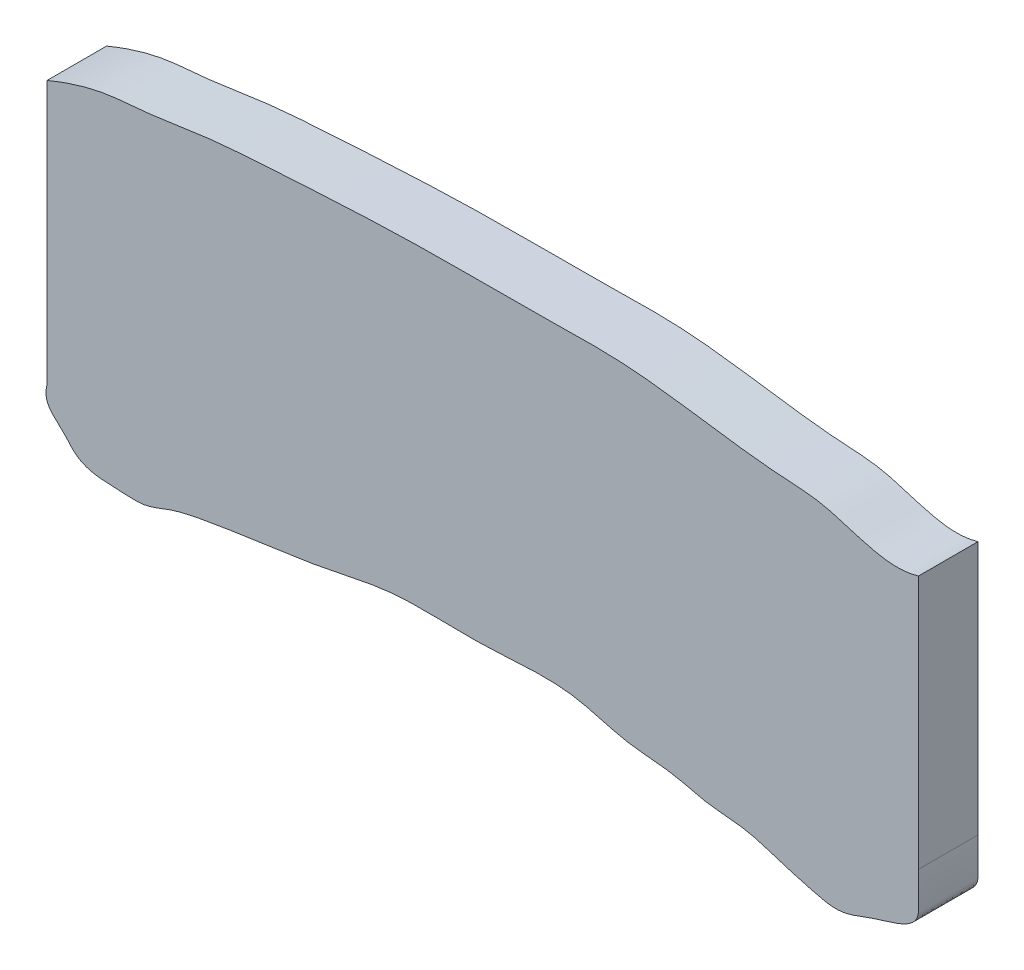
ISO-10303-21;
HEADER;
FILE_DESCRIPTION(('STEP AP214'),'2;1');
FILE_NAME('part.step','',(''),(''),'','','');
FILE_SCHEMA(('AUTOMOTIVE_DESIGN { 1 0 10303 214 1 1 1 1 }'));
ENDSEC;
DATA;
#1=APPLICATION_CONTEXT('core data for automotive mechanical design processes');
#2=APPLICATION_PROTOCOL_DEFINITION('international standard','automotive_design',2000,#1);
#3=PRODUCT_CONTEXT('',#1,'mechanical');
#4=PRODUCT('Part','Part','',(#3));
#5=PRODUCT_RELATED_PRODUCT_CATEGORY('part','',(#4));
#6=PRODUCT_DEFINITION_FORMATION('','',#4);
#7=PRODUCT_DEFINITION_CONTEXT('part definition',#1,'design');
#8=PRODUCT_DEFINITION('design','',#6,#7);
#9=PRODUCT_DEFINITION_SHAPE('','',#8);
#10=(LENGTH_UNIT() NAMED_UNIT(*) SI_UNIT(.MILLI.,.METRE.));
#11=(NAMED_UNIT(*) PLANE_ANGLE_UNIT() SI_UNIT($,.RADIAN.));
#12=(NAMED_UNIT(*) SI_UNIT($,.STERADIAN.) SOLID_ANGLE_UNIT());
#13=UNCERTAINTY_MEASURE_WITH_UNIT(LENGTH_MEASURE(1.E-05),#10,'distance_accuracy_value','');
#14=(GEOMETRIC_REPRESENTATION_CONTEXT(3) GLOBAL_UNCERTAINTY_ASSIGNED_CONTEXT((#13)) GLOBAL_UNIT_ASSIGNED_CONTEXT((#10,
#11,#12)) REPRESENTATION_CONTEXT('',''));
#15=CARTESIAN_POINT('',(0.,0.,0.));
#16=DIRECTION('',(0.,0.,1.));
#17=DIRECTION('',(1.,0.,0.));
#18=AXIS2_PLACEMENT_3D('',#15,#16,#17);
#19=CARTESIAN_POINT('',(-13.2571013773825,28.2585387527898,3.8));
#20=CARTESIAN_POINT('',(-15.4974356512467,27.6047260400092,3.8));
#21=CARTESIAN_POINT('',(-18.1835189397139,29.253879384158,3.8));
#22=CARTESIAN_POINT('',(-24.7072844304815,29.4672567119172,3.8));
#23=CARTESIAN_POINT('',(-30.3740244250129,30.768039626684,3.8));
#24=CARTESIAN_POINT('',(-38.3489185422582,30.5368464191479,3.8));
#25=CARTESIAN_POINT('',(-44.7116833381105,30.6412577327282,3.8));
#26=CARTESIAN_POINT('',(-51.0260034583777,30.3316254636872,3.8));
#27=CARTESIAN_POINT('',(-55.4847653405452,30.067836130243,3.8));
#28=CARTESIAN_POINT('',(-59.0076715337762,29.7964066333727,3.8));
#29=CARTESIAN_POINT('',(-62.2296668189302,29.2069217500653,3.8));
#30=CARTESIAN_POINT('',(-65.5795644303926,29.069387662969,3.8));
#31=CARTESIAN_POINT('',(-67.7811100596924,28.2991119938992,3.8));
#32=CARTESIAN_POINT('',(-68.8776447884064,27.8462543284039,3.8));
#33=B_SPLINE_CURVE_WITH_KNOTS('',3,(#19,#20,#21,#22,#23,#24,#25,#26,#27,#28,#29,#30,#31,#32),
.UNSPECIFIED.,.F.,.F.,(4,1,1,1,1,1,1,1,1,1,1,4),(0.,0.114786769284681,0.156767313353473,
0.347335793623414,0.423148652275247,0.582582532626668,0.688002569693344,0.761196082766196,
0.821657938446115,0.876842424501546,0.93630929657201,1.),.UNSPECIFIED.);
#34=DIRECTION('',(0.,0.,-1.));
#35=VECTOR('',#34,1.);
#36=SURFACE_OF_LINEAR_EXTRUSION('',#33,#35);
#37=CARTESIAN_POINT('',(-13.2571013773825,28.2585387527898,0.));
#38=CARTESIAN_POINT('',(-15.4974356512467,27.6047260400092,0.));
#39=CARTESIAN_POINT('',(-18.1835189397139,29.253879384158,0.));
#40=CARTESIAN_POINT('',(-24.7072844304815,29.4672567119172,0.));
#41=CARTESIAN_POINT('',(-30.3740244250129,30.768039626684,0.));
#42=CARTESIAN_POINT('',(-38.3489185422582,30.5368464191479,0.));
#43=CARTESIAN_POINT('',(-44.7116833381105,30.6412577327282,0.));
#44=CARTESIAN_POINT('',(-51.0260034583777,30.3316254636872,0.));
#45=CARTESIAN_POINT('',(-55.4847653405452,30.067836130243,0.));
#46=CARTESIAN_POINT('',(-59.0076715337762,29.7964066333727,0.));
#47=CARTESIAN_POINT('',(-62.2296668189302,29.2069217500653,0.));
#48=CARTESIAN_POINT('',(-65.5795644303926,29.069387662969,0.));
#49=CARTESIAN_POINT('',(-67.7811100596924,28.2991119938992,0.));
#50=CARTESIAN_POINT('',(-68.8776447884064,27.8462543284039,0.));
#51=B_SPLINE_CURVE_WITH_KNOTS('',3,(#37,#38,#39,#40,#41,#42,#43,#44,#45,#46,#47,#48,#49,#50),
.UNSPECIFIED.,.F.,.F.,(4,1,1,1,1,1,1,1,1,1,1,4),(0.,0.114786769284681,0.156767313353473,
0.347335793623414,0.423148652275247,0.582582532626668,0.688002569693344,0.761196082766196,
0.821657938446115,0.876842424501546,0.93630929657201,1.),.UNSPECIFIED.);
#52=CARTESIAN_POINT('',(-13.2571013773825,28.2585387527898,0.));
#53=VERTEX_POINT('',#52);
#54=CARTESIAN_POINT('',(-68.8776447884064,27.8462543284039,0.));
#55=VERTEX_POINT('',#54);
#56=EDGE_CURVE('E113',#53,#55,#51,.T.);
#57=ORIENTED_EDGE('',*,*,#56,.T.);
#58=DIRECTION('',(0.,0.,-1.));
#59=VECTOR('',#58,1.);
#60=CARTESIAN_POINT('',(-68.8776447884064,27.8462543284039,3.8));
#61=LINE('',#60,#59);
#62=CARTESIAN_POINT('',(-68.8776447884064,27.8462543284039,3.8));
#63=VERTEX_POINT('',#62);
#64=EDGE_CURVE('E11',#63,#55,#61,.T.);
#65=ORIENTED_EDGE('',*,*,#64,.F.);
#66=CARTESIAN_POINT('',(-13.2571013773825,28.2585387527898,3.8));
#67=VERTEX_POINT('',#66);
#68=EDGE_CURVE('E82',#67,#63,#33,.T.);
#69=ORIENTED_EDGE('',*,*,#68,.F.);
#70=DIRECTION('',(0.,0.,-1.));
#71=VECTOR('',#70,1.);
#72=CARTESIAN_POINT('',(-13.2571013773825,28.2585387527898,3.8));
#73=LINE('',#72,#71);
#74=EDGE_CURVE('E90',#67,#53,#73,.T.);
#75=ORIENTED_EDGE('',*,*,#74,.T.);
#76=EDGE_LOOP('',(#57,#65,#69,#75));
#77=FACE_BOUND('',#76,.T.);
#78=ADVANCED_FACE('F30',(#77),#36,.F.);
#79=CARTESIAN_POINT('',(-68.8776447884064,11.0225629397963,3.8));
#80=DIRECTION('',(1.,0.,0.));
#81=DIRECTION('',(0.,0.,-1.));
#82=AXIS2_PLACEMENT_3D('',#79,#80,#81);
#83=PLANE('',#82);
#84=DIRECTION('',(0.,-1.,0.));
#85=VECTOR('',#84,1.);
#86=CARTESIAN_POINT('',(-68.8776447884064,11.0225629397963,0.));
#87=LINE('',#86,#85);
#88=CARTESIAN_POINT('',(-68.8776447884064,11.0225629397963,0.));
#89=VERTEX_POINT('',#88);
#90=EDGE_CURVE('E86',#55,#89,#87,.T.);
#91=ORIENTED_EDGE('',*,*,#90,.T.);
#92=DIRECTION('',(0.,0.,-1.));
#93=VECTOR('',#92,1.);
#94=CARTESIAN_POINT('',(-68.8776447884064,11.0225629397963,3.8));
#95=LINE('',#94,#93);
#96=CARTESIAN_POINT('',(-68.8776447884064,11.0225629397963,3.8));
#97=VERTEX_POINT('',#96);
#98=EDGE_CURVE('E39',#97,#89,#95,.T.);
#99=ORIENTED_EDGE('',*,*,#98,.F.);
#100=DIRECTION('',(0.,-1.,0.));
#101=VECTOR('',#100,1.);
#102=CARTESIAN_POINT('',(-68.8776447884064,11.0225629397963,3.8));
#103=LINE('',#102,#101);
#104=EDGE_CURVE('E77',#63,#97,#103,.T.);
#105=ORIENTED_EDGE('',*,*,#104,.F.);
#106=ORIENTED_EDGE('',*,*,#64,.T.);
#107=EDGE_LOOP('',(#91,#99,#105,#106));
#108=FACE_BOUND('',#107,.T.);
#109=ADVANCED_FACE('F85',(#108),#83,.F.);
#110=CARTESIAN_POINT('',(-68.8776447884064,11.0225629397963,3.8));
#111=CARTESIAN_POINT('',(-69.1801331740039,9.88886866253025,3.8));
#112=CARTESIAN_POINT('',(-68.0385446974706,9.31875397084859,3.8));
#113=CARTESIAN_POINT('',(-67.1607388550849,8.07564198737336,3.8));
#114=CARTESIAN_POINT('',(-65.9525258383593,7.51272839023202,3.8));
#115=CARTESIAN_POINT('',(-64.4349927334834,7.53570261452736,3.8));
#116=CARTESIAN_POINT('',(-62.6555480428296,7.3276703406939,3.8));
#117=CARTESIAN_POINT('',(-61.2181077357448,8.01659142880944,3.8));
#118=CARTESIAN_POINT('',(-59.579889282632,8.44247201119246,3.8));
#119=CARTESIAN_POINT('',(-57.5976631469556,8.76279300005304,3.8));
#120=CARTESIAN_POINT('',(-54.8434572941524,9.19948019252067,3.8));
#121=CARTESIAN_POINT('',(-51.1924954264402,9.64176816487813,3.8));
#122=CARTESIAN_POINT('',(-47.4680875965891,10.6218741755071,3.8));
#123=CARTESIAN_POINT('',(-43.8164284846969,10.5816376763475,3.8));
#124=CARTESIAN_POINT('',(-39.918379972825,10.5066646761117,3.8));
#125=CARTESIAN_POINT('',(-35.7934576787383,11.0551699379964,3.8));
#126=CARTESIAN_POINT('',(-31.9769408749427,9.64438231955807,3.8));
#127=CARTESIAN_POINT('',(-29.1382623442443,9.62129141954682,3.8));
#128=CARTESIAN_POINT('',(-26.669291439574,8.85314280796288,3.8));
#129=CARTESIAN_POINT('',(-24.2415704645576,8.84903898893933,3.8));
#130=CARTESIAN_POINT('',(-22.1119747975757,8.04409317571984,3.8));
#131=CARTESIAN_POINT('',(-20.2400550822575,7.55828470085166,3.8));
#132=CARTESIAN_POINT('',(-18.2151291905002,6.98428652402233,3.8));
#133=CARTESIAN_POINT('',(-16.0355502017449,8.09366784525477,3.8));
#134=CARTESIAN_POINT('',(-13.1855585264609,8.6045873931349,3.8));
#135=CARTESIAN_POINT('',(-13.289243985974,10.585395842016,3.8));
#136=CARTESIAN_POINT('',(-13.2332642316722,11.354396414426,3.8));
#137=CARTESIAN_POINT('',(-13.2571013773825,12.04340880554,3.8));
#138=B_SPLINE_CURVE_WITH_KNOTS('',3,(#110,#111,#112,#113,#114,#115,#116,#117,#118,#119,#120,
#121,#122,#123,#124,#125,#126,#127,#128,#129,#130,#131,#132,#133,#134,#135,#136,#137),
.UNSPECIFIED.,.F.,.F.,(4,1,1,1,1,1,1,1,1,1,1,1,1,1,1,1,1,1,1,1,1,1,1,1,1,4),(0.,
0.0401336436239771,0.0581429267244263,0.0734177471942562,0.103139507655167,0.132113339114979,
0.159260983546045,0.17930823689424,0.215301268401331,0.257644740989504,0.316224866438858,
0.395793982431059,0.445168469205218,0.494531293173787,0.587891416766515,0.644114329299145,
0.690568740367679,0.725720091777976,0.770043350070982,0.80807428351838,0.835933706272317,
0.866455947904134,0.905517554745047,0.960777611601519,0.966811825201285,1.),.UNSPECIFIED.);
#139=DIRECTION('',(0.,0.,-1.));
#140=VECTOR('',#139,1.);
#141=SURFACE_OF_LINEAR_EXTRUSION('',#138,#140);
#142=CARTESIAN_POINT('',(-68.8776447884064,11.0225629397963,0.));
#143=CARTESIAN_POINT('',(-69.1801331740039,9.88886866253025,0.));
#144=CARTESIAN_POINT('',(-68.0385446974706,9.31875397084859,0.));
#145=CARTESIAN_POINT('',(-67.1607388550849,8.07564198737336,0.));
#146=CARTESIAN_POINT('',(-65.9525258383593,7.51272839023202,0.));
#147=CARTESIAN_POINT('',(-64.4349927334834,7.53570261452736,0.));
#148=CARTESIAN_POINT('',(-62.6555480428296,7.3276703406939,0.));
#149=CARTESIAN_POINT('',(-61.2181077357448,8.01659142880944,0.));
#150=CARTESIAN_POINT('',(-59.579889282632,8.44247201119246,0.));
#151=CARTESIAN_POINT('',(-57.5976631469556,8.76279300005304,0.));
#152=CARTESIAN_POINT('',(-54.8434572941524,9.19948019252067,0.));
#153=CARTESIAN_POINT('',(-51.1924954264402,9.64176816487813,0.));
#154=CARTESIAN_POINT('',(-47.4680875965891,10.6218741755071,0.));
#155=CARTESIAN_POINT('',(-43.8164284846969,10.5816376763475,0.));
#156=CARTESIAN_POINT('',(-39.918379972825,10.5066646761117,0.));
#157=CARTESIAN_POINT('',(-35.7934576787383,11.0551699379964,0.));
#158=CARTESIAN_POINT('',(-31.9769408749427,9.64438231955807,0.));
#159=CARTESIAN_POINT('',(-29.1382623442443,9.62129141954682,0.));
#160=CARTESIAN_POINT('',(-26.669291439574,8.85314280796288,0.));
#161=CARTESIAN_POINT('',(-24.2415704645576,8.84903898893933,0.));
#162=CARTESIAN_POINT('',(-22.1119747975757,8.04409317571984,0.));
#163=CARTESIAN_POINT('',(-20.2400550822575,7.55828470085166,0.));
#164=CARTESIAN_POINT('',(-18.2151291905002,6.98428652402233,0.));
#165=CARTESIAN_POINT('',(-16.0355502017449,8.09366784525477,0.));
#166=CARTESIAN_POINT('',(-13.1855585264609,8.6045873931349,0.));
#167=CARTESIAN_POINT('',(-13.289243985974,10.585395842016,0.));
#168=CARTESIAN_POINT('',(-13.2332642316722,11.354396414426,0.));
#169=CARTESIAN_POINT('',(-13.2571013773825,12.04340880554,0.));
#170=B_SPLINE_CURVE_WITH_KNOTS('',3,(#142,#143,#144,#145,#146,#147,#148,#149,#150,#151,#152,
#153,#154,#155,#156,#157,#158,#159,#160,#161,#162,#163,#164,#165,#166,#167,#168,#169),
.UNSPECIFIED.,.F.,.F.,(4,1,1,1,1,1,1,1,1,1,1,1,1,1,1,1,1,1,1,1,1,1,1,1,1,4),(0.,
0.0401336436239771,0.0581429267244263,0.0734177471942562,0.103139507655167,0.132113339114979,
0.159260983546045,0.17930823689424,0.215301268401331,0.257644740989504,0.316224866438858,
0.395793982431059,0.445168469205218,0.494531293173787,0.587891416766515,0.644114329299145,
0.690568740367679,0.725720091777976,0.770043350070982,0.80807428351838,0.835933706272317,
0.866455947904134,0.905517554745047,0.960777611601519,0.966811825201285,1.),.UNSPECIFIED.);
#171=CARTESIAN_POINT('',(-13.2571013773825,12.04340880554,0.));
#172=VERTEX_POINT('',#171);
#173=EDGE_CURVE('E64',#89,#172,#170,.T.);
#174=ORIENTED_EDGE('',*,*,#173,.T.);
#175=DIRECTION('',(0.,0.,-1.));
#176=VECTOR('',#175,1.);
#177=CARTESIAN_POINT('',(-13.2571013773825,12.04340880554,3.8));
#178=LINE('',#177,#176);
#179=CARTESIAN_POINT('',(-13.2571013773825,12.04340880554,3.8));
#180=VERTEX_POINT('',#179);
#181=EDGE_CURVE('E87',#180,#172,#178,.T.);
#182=ORIENTED_EDGE('',*,*,#181,.F.);
#183=EDGE_CURVE('E80',#97,#180,#138,.T.);
#184=ORIENTED_EDGE('',*,*,#183,.F.);
#185=ORIENTED_EDGE('',*,*,#98,.T.);
#186=EDGE_LOOP('',(#174,#182,#184,#185));
#187=FACE_BOUND('',#186,.T.);
#188=ADVANCED_FACE('F88',(#187),#141,.F.);
#189=CARTESIAN_POINT('',(-13.2571013773825,28.2585387527898,3.8));
#190=DIRECTION('',(-1.,0.,0.));
#191=DIRECTION('',(0.,-1.,0.));
#192=AXIS2_PLACEMENT_3D('',#189,#190,#191);
#193=PLANE('',#192);
#194=DIRECTION('',(0.,1.,0.));
#195=VECTOR('',#194,1.);
#196=CARTESIAN_POINT('',(-13.2571013773825,28.2585387527898,0.));
#197=LINE('',#196,#195);
#198=EDGE_CURVE('E70',#172,#53,#197,.T.);
#199=ORIENTED_EDGE('',*,*,#198,.T.);
#200=ORIENTED_EDGE('',*,*,#74,.F.);
#201=DIRECTION('',(0.,1.,0.));
#202=VECTOR('',#201,1.);
#203=CARTESIAN_POINT('',(-13.2571013773825,28.2585387527898,3.8));
#204=LINE('',#203,#202);
#205=EDGE_CURVE('E47',#180,#67,#204,.T.);
#206=ORIENTED_EDGE('',*,*,#205,.F.);
#207=ORIENTED_EDGE('',*,*,#181,.T.);
#208=EDGE_LOOP('',(#199,#200,#206,#207));
#209=FACE_BOUND('',#208,.T.);
#210=ADVANCED_FACE('F102',(#209),#193,.F.);
#211=CARTESIAN_POINT('',(-41.0924904330479,30.5814954198622,3.8));
#212=DIRECTION('',(0.,0.,1.));
#213=DIRECTION('',(1.,0.,0.));
#214=AXIS2_PLACEMENT_3D('',#211,#212,#213);
#215=PLANE('',#214);
#216=ORIENTED_EDGE('',*,*,#68,.T.);
#217=ORIENTED_EDGE('',*,*,#104,.T.);
#218=ORIENTED_EDGE('',*,*,#183,.T.);
#219=ORIENTED_EDGE('',*,*,#205,.T.);
#220=EDGE_LOOP('',(#216,#217,#218,#219));
#221=FACE_BOUND('',#220,.T.);
#222=ADVANCED_FACE('F78',(#221),#215,.T.);
#223=CARTESIAN_POINT('',(-41.0924904330479,30.5814954198622,0.));
#224=DIRECTION('',(0.,0.,1.));
#225=DIRECTION('',(1.,0.,0.));
#226=AXIS2_PLACEMENT_3D('',#223,#224,#225);
#227=PLANE('',#226);
#228=ORIENTED_EDGE('',*,*,#56,.F.);
#229=ORIENTED_EDGE('',*,*,#198,.F.);
#230=ORIENTED_EDGE('',*,*,#173,.F.);
#231=ORIENTED_EDGE('',*,*,#90,.F.);
#232=EDGE_LOOP('',(#228,#229,#230,#231));
#233=FACE_BOUND('',#232,.T.);
#234=ADVANCED_FACE('F130',(#233),#227,.F.);
#235=CLOSED_SHELL('',(#78,#109,#188,#210,#222,#234));
#236=MANIFOLD_SOLID_BREP('B2',#235);
#237=ADVANCED_BREP_SHAPE_REPRESENTATION('',(#18,#236),#14);
#238=SHAPE_DEFINITION_REPRESENTATION(#9,#237);
ENDSEC;
END-ISO-10303-21;
